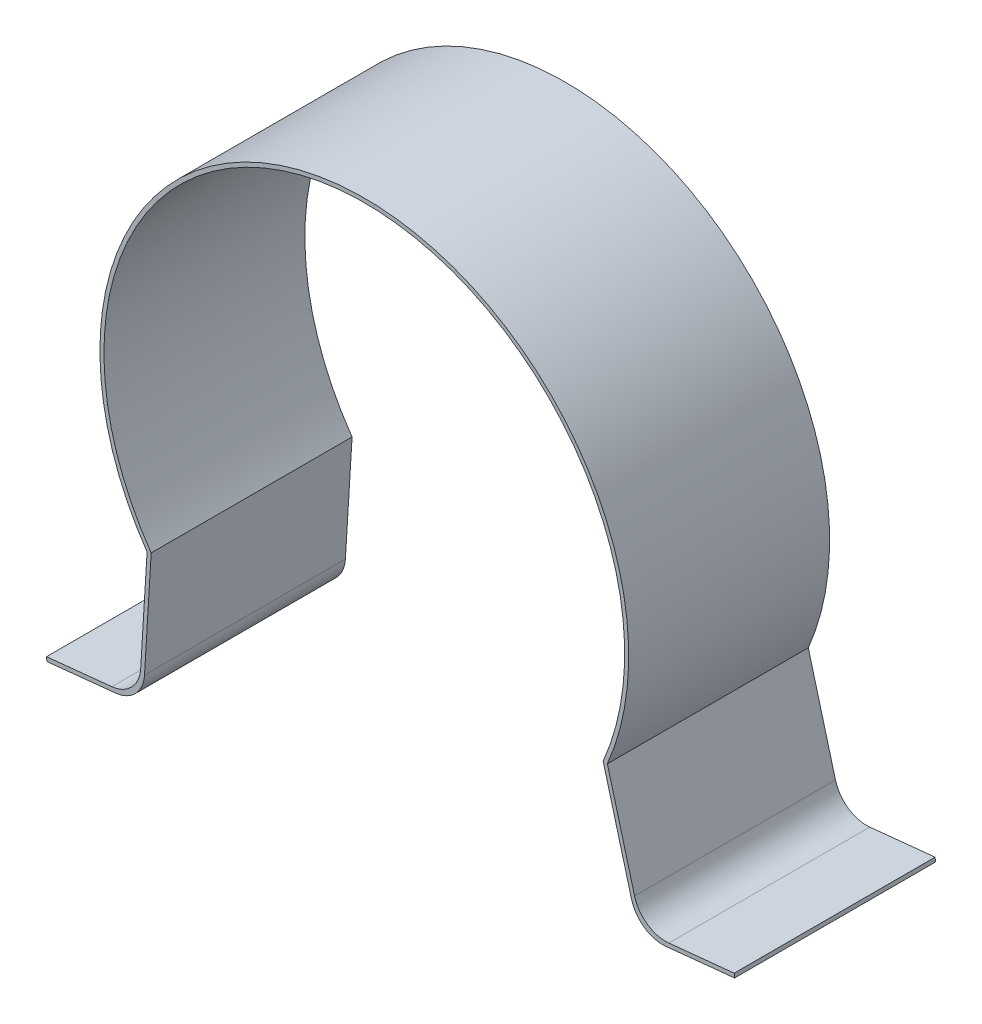
ISO-10303-21;
HEADER;
FILE_DESCRIPTION(('STEP AP214'),'2;1');
FILE_NAME('part.step','',(''),(''),'','','');
FILE_SCHEMA(('AUTOMOTIVE_DESIGN { 1 0 10303 214 1 1 1 1 }'));
ENDSEC;
DATA;
#1=APPLICATION_CONTEXT('core data for automotive mechanical design processes');
#2=APPLICATION_PROTOCOL_DEFINITION('international standard','automotive_design',2000,#1);
#3=PRODUCT_CONTEXT('',#1,'mechanical');
#4=PRODUCT('Part','Part','',(#3));
#5=PRODUCT_RELATED_PRODUCT_CATEGORY('part','',(#4));
#6=PRODUCT_DEFINITION_FORMATION('','',#4);
#7=PRODUCT_DEFINITION_CONTEXT('part definition',#1,'design');
#8=PRODUCT_DEFINITION('design','',#6,#7);
#9=PRODUCT_DEFINITION_SHAPE('','',#8);
#10=(LENGTH_UNIT() NAMED_UNIT(*) SI_UNIT(.MILLI.,.METRE.));
#11=(NAMED_UNIT(*) PLANE_ANGLE_UNIT() SI_UNIT($,.RADIAN.));
#12=(NAMED_UNIT(*) SI_UNIT($,.STERADIAN.) SOLID_ANGLE_UNIT());
#13=UNCERTAINTY_MEASURE_WITH_UNIT(LENGTH_MEASURE(1.E-05),#10,'distance_accuracy_value','');
#14=(GEOMETRIC_REPRESENTATION_CONTEXT(3) GLOBAL_UNCERTAINTY_ASSIGNED_CONTEXT((#13)) GLOBAL_UNIT_ASSIGNED_CONTEXT((#10,
#11,#12)) REPRESENTATION_CONTEXT('',''));
#15=CARTESIAN_POINT('',(0.,0.,0.));
#16=DIRECTION('',(0.,0.,1.));
#17=DIRECTION('',(1.,0.,0.));
#18=AXIS2_PLACEMENT_3D('',#15,#16,#17);
#19=CARTESIAN_POINT('',(34.13885107895,-29.3253596362525,25.));
#20=DIRECTION('',(-0.100816946259273,0.994904992120833,0.));
#21=DIRECTION('',(-0.994904992120833,-0.100816946259273,0.));
#22=AXIS2_PLACEMENT_3D('',#19,#20,#21);
#23=PLANE('',#22);
#24=DIRECTION('',(0.994904992120833,0.100816946259273,0.));
#25=VECTOR('',#24,1.);
#26=CARTESIAN_POINT('',(34.13885107895,-29.3253596362525,25.));
#27=LINE('',#26,#25);
#28=CARTESIAN_POINT('',(37.5202837419189,-28.9827081089592,25.));
#29=VERTEX_POINT('',#28);
#30=CARTESIAN_POINT('',(46.0777109843999,-28.1155562811412,25.));
#31=VERTEX_POINT('',#30);
#32=EDGE_CURVE('E144',#29,#31,#27,.T.);
#33=ORIENTED_EDGE('',*,*,#32,.F.);
#34=DIRECTION('',(0.,0.,-1.));
#35=VECTOR('',#34,1.);
#36=CARTESIAN_POINT('',(37.5202837419189,-28.9827081089592,25.));
#37=LINE('',#36,#35);
#38=CARTESIAN_POINT('',(37.5202837419189,-28.9827081089592,0.));
#39=VERTEX_POINT('',#38);
#40=EDGE_CURVE('E256',#29,#39,#37,.T.);
#41=ORIENTED_EDGE('',*,*,#40,.T.);
#42=DIRECTION('',(0.994904992120833,0.100816946259273,0.));
#43=VECTOR('',#42,1.);
#44=CARTESIAN_POINT('',(34.13885107895,-29.3253596362525,0.));
#45=LINE('',#44,#43);
#46=CARTESIAN_POINT('',(46.0777109843999,-28.1155562811412,0.));
#47=VERTEX_POINT('',#46);
#48=EDGE_CURVE('E159',#39,#47,#45,.T.);
#49=ORIENTED_EDGE('',*,*,#48,.T.);
#50=DIRECTION('',(0.,0.,-1.));
#51=VECTOR('',#50,1.);
#52=CARTESIAN_POINT('',(46.0777109843999,-28.1155562811412,25.));
#53=LINE('',#52,#51);
#54=EDGE_CURVE('E157',#31,#47,#53,.T.);
#55=ORIENTED_EDGE('',*,*,#54,.F.);
#56=EDGE_LOOP('',(#33,#41,#49,#55));
#57=FACE_BOUND('',#56,.T.);
#58=ADVANCED_FACE('F32',(#57),#23,.F.);
#59=CARTESIAN_POINT('',(46.0273025112703,-27.6181037850808,25.));
#60=DIRECTION('',(0.994904992120833,0.100816946259269,0.));
#61=DIRECTION('',(-0.100816946259269,0.994904992120833,0.));
#62=AXIS2_PLACEMENT_3D('',#59,#60,#61);
#63=PLANE('',#62);
#64=DIRECTION('',(0.100816946259269,-0.994904992120833,0.));
#65=VECTOR('',#64,1.);
#66=CARTESIAN_POINT('',(46.0273025112703,-27.6181037850808,0.));
#67=LINE('',#66,#65);
#68=CARTESIAN_POINT('',(46.0273025112703,-27.6181037850808,0.));
#69=VERTEX_POINT('',#68);
#70=EDGE_CURVE('E198',#69,#47,#67,.T.);
#71=ORIENTED_EDGE('',*,*,#70,.F.);
#72=DIRECTION('',(0.,0.,-1.));
#73=VECTOR('',#72,1.);
#74=CARTESIAN_POINT('',(46.0273025112703,-27.6181037850808,25.));
#75=LINE('',#74,#73);
#76=CARTESIAN_POINT('',(46.0273025112703,-27.6181037850808,25.));
#77=VERTEX_POINT('',#76);
#78=EDGE_CURVE('E164',#77,#69,#75,.T.);
#79=ORIENTED_EDGE('',*,*,#78,.F.);
#80=DIRECTION('',(0.100816946259269,-0.994904992120833,0.));
#81=VECTOR('',#80,1.);
#82=CARTESIAN_POINT('',(46.0273025112703,-27.6181037850808,25.));
#83=LINE('',#82,#81);
#84=EDGE_CURVE('E149',#77,#31,#83,.T.);
#85=ORIENTED_EDGE('',*,*,#84,.T.);
#86=ORIENTED_EDGE('',*,*,#54,.T.);
#87=EDGE_LOOP('',(#71,#79,#85,#86));
#88=FACE_BOUND('',#87,.T.);
#89=ADVANCED_FACE('F167',(#88),#63,.T.);
#90=CARTESIAN_POINT('',(34.0884426058203,-28.827907140192,25.));
#91=DIRECTION('',(-0.100816946259273,0.994904992120833,0.));
#92=DIRECTION('',(-0.994904992120833,-0.100816946259273,0.));
#93=AXIS2_PLACEMENT_3D('',#90,#91,#92);
#94=PLANE('',#93);
#95=DIRECTION('',(0.994904992120833,0.100816946259273,0.));
#96=VECTOR('',#95,1.);
#97=CARTESIAN_POINT('',(34.0884426058203,-28.827907140192,0.));
#98=LINE('',#97,#96);
#99=CARTESIAN_POINT('',(37.8925543516604,-28.4424241719871,0.));
#100=VERTEX_POINT('',#99);
#101=EDGE_CURVE('E200',#100,#69,#98,.T.);
#102=ORIENTED_EDGE('',*,*,#101,.F.);
#103=DIRECTION('',(0.,0.,-1.));
#104=VECTOR('',#103,1.);
#105=CARTESIAN_POINT('',(37.8925543516604,-28.4424241719871,25.));
#106=LINE('',#105,#104);
#107=CARTESIAN_POINT('',(37.8925543516604,-28.4424241719871,25.));
#108=VERTEX_POINT('',#107);
#109=EDGE_CURVE('E47',#100,#108,#106,.F.);
#110=ORIENTED_EDGE('',*,*,#109,.T.);
#111=DIRECTION('',(0.994904992120833,0.100816946259273,0.));
#112=VECTOR('',#111,1.);
#113=CARTESIAN_POINT('',(34.0884426058203,-28.827907140192,25.));
#114=LINE('',#113,#112);
#115=EDGE_CURVE('E169',#108,#77,#114,.T.);
#116=ORIENTED_EDGE('',*,*,#115,.T.);
#117=ORIENTED_EDGE('',*,*,#78,.T.);
#118=EDGE_LOOP('',(#102,#110,#116,#117));
#119=FACE_BOUND('',#118,.T.);
#120=ADVANCED_FACE('F291',(#119),#94,.T.);
#121=CARTESIAN_POINT('',(30.1993785986346,-12.7805551171039,25.));
#122=DIRECTION('',(0.965572828298591,0.260132876144979,0.));
#123=DIRECTION('',(-0.260132876144979,0.965572828298591,0.));
#124=AXIS2_PLACEMENT_3D('',#121,#122,#123);
#125=PLANE('',#124);
#126=DIRECTION('',(0.260132876144979,-0.965572828298591,0.));
#127=VECTOR('',#126,1.);
#128=CARTESIAN_POINT('',(30.1993785986346,-12.7805551171039,25.));
#129=LINE('',#128,#127);
#130=CARTESIAN_POINT('',(30.2446820545754,-12.9487145083071,25.));
#131=VERTEX_POINT('',#130);
#132=CARTESIAN_POINT('',(33.6269952534289,-25.5033357080837,25.));
#133=VERTEX_POINT('',#132);
#134=EDGE_CURVE('E171',#131,#133,#129,.T.);
#135=ORIENTED_EDGE('',*,*,#134,.T.);
#136=DIRECTION('',(0.,0.,-1.));
#137=VECTOR('',#136,1.);
#138=CARTESIAN_POINT('',(33.6269952534289,-25.5033357080837,0.));
#139=LINE('',#138,#137);
#140=CARTESIAN_POINT('',(33.6269952534289,-25.5033357080837,0.));
#141=VERTEX_POINT('',#140);
#142=EDGE_CURVE('E260',#133,#141,#139,.T.);
#143=ORIENTED_EDGE('',*,*,#142,.T.);
#144=DIRECTION('',(0.260132876144979,-0.965572828298591,0.));
#145=VECTOR('',#144,1.);
#146=CARTESIAN_POINT('',(30.1993785986346,-12.7805551171039,0.));
#147=LINE('',#146,#145);
#148=CARTESIAN_POINT('',(30.2446820545754,-12.9487145083071,0.));
#149=VERTEX_POINT('',#148);
#150=EDGE_CURVE('E202',#149,#141,#147,.T.);
#151=ORIENTED_EDGE('',*,*,#150,.F.);
#152=DIRECTION('',(0.,0.,-1.));
#153=VECTOR('',#152,1.);
#154=CARTESIAN_POINT('',(30.2446820545754,-12.9487145083071,25.));
#155=LINE('',#154,#153);
#156=EDGE_CURVE('E236',#131,#149,#155,.T.);
#157=ORIENTED_EDGE('',*,*,#156,.F.);
#158=EDGE_LOOP('',(#135,#143,#151,#157));
#159=FACE_BOUND('',#158,.T.);
#160=ADVANCED_FACE('F351',(#159),#125,.T.);
#161=CARTESIAN_POINT('',(0.,0.,25.));
#162=DIRECTION('',(0.,0.,-1.));
#163=DIRECTION('',(-1.,0.,0.));
#164=AXIS2_PLACEMENT_3D('',#161,#162,#163);
#165=CYLINDRICAL_SURFACE('',#164,32.9);
#166=CARTESIAN_POINT('',(0.,0.,0.));
#167=DIRECTION('',(0.,0.,1.));
#168=DIRECTION('',(1.,0.,0.));
#169=AXIS2_PLACEMENT_3D('',#166,#167,#168);
#170=CIRCLE('',#169,32.9);
#171=CARTESIAN_POINT('',(-27.0324178448474,-18.75255677132,0.));
#172=VERTEX_POINT('',#171);
#173=EDGE_CURVE('E204',#172,#149,#170,.F.);
#174=ORIENTED_EDGE('',*,*,#173,.F.);
#175=DIRECTION('',(0.,0.,-1.));
#176=VECTOR('',#175,1.);
#177=CARTESIAN_POINT('',(-27.0324178448474,-18.75255677132,25.));
#178=LINE('',#177,#176);
#179=CARTESIAN_POINT('',(-27.0324178448474,-18.75255677132,25.));
#180=VERTEX_POINT('',#179);
#181=EDGE_CURVE('E233',#180,#172,#178,.T.);
#182=ORIENTED_EDGE('',*,*,#181,.F.);
#183=CARTESIAN_POINT('',(0.,0.,25.));
#184=DIRECTION('',(0.,0.,1.));
#185=DIRECTION('',(1.,0.,0.));
#186=AXIS2_PLACEMENT_3D('',#183,#184,#185);
#187=CIRCLE('',#186,32.9);
#188=EDGE_CURVE('E176',#180,#131,#187,.F.);
#189=ORIENTED_EDGE('',*,*,#188,.T.);
#190=ORIENTED_EDGE('',*,*,#156,.T.);
#191=EDGE_LOOP('',(#174,#182,#189,#190));
#192=FACE_BOUND('',#191,.T.);
#193=ADVANCED_FACE('F347',(#192),#165,.T.);
#194=CARTESIAN_POINT('',(-27.0217867900378,-18.5787545248821,25.));
#195=DIRECTION('',(-0.998134499547706,0.0610534258879136,0.));
#196=DIRECTION('',(-0.0610534258879136,-0.998134499547706,0.));
#197=AXIS2_PLACEMENT_3D('',#194,#195,#196);
#198=PLANE('',#197);
#199=DIRECTION('',(0.0610534258879136,0.998134499547706,0.));
#200=VECTOR('',#199,1.);
#201=CARTESIAN_POINT('',(-27.0217867900378,-18.5787545248821,0.));
#202=LINE('',#201,#200);
#203=CARTESIAN_POINT('',(-27.8264931343679,-31.7345300215016,0.));
#204=VERTEX_POINT('',#203);
#205=EDGE_CURVE('E207',#204,#172,#202,.T.);
#206=ORIENTED_EDGE('',*,*,#205,.F.);
#207=DIRECTION('',(0.,0.,-1.));
#208=VECTOR('',#207,1.);
#209=CARTESIAN_POINT('',(-27.8264931343679,-31.7345300215016,25.));
#210=LINE('',#209,#208);
#211=CARTESIAN_POINT('',(-27.8264931343679,-31.7345300215016,25.));
#212=VERTEX_POINT('',#211);
#213=EDGE_CURVE('E241',#204,#212,#210,.F.);
#214=ORIENTED_EDGE('',*,*,#213,.T.);
#215=DIRECTION('',(0.0610534258879136,0.998134499547706,0.));
#216=VECTOR('',#215,1.);
#217=CARTESIAN_POINT('',(-27.0217867900378,-18.5787545248821,25.));
#218=LINE('',#217,#216);
#219=EDGE_CURVE('E179',#212,#180,#218,.T.);
#220=ORIENTED_EDGE('',*,*,#219,.T.);
#221=ORIENTED_EDGE('',*,*,#181,.T.);
#222=EDGE_LOOP('',(#206,#214,#220,#221));
#223=FACE_BOUND('',#222,.T.);
#224=ADVANCED_FACE('F344',(#223),#198,.T.);
#225=CARTESIAN_POINT('',(-27.6115898740664,-35.0801716455074,25.));
#226=DIRECTION('',(-0.101924187415924,0.99479216925929,0.));
#227=DIRECTION('',(-0.99479216925929,-0.101924187415924,0.));
#228=AXIS2_PLACEMENT_3D('',#225,#226,#227);
#229=PLANE('',#228);
#230=DIRECTION('',(0.99479216925929,0.101924187415924,0.));
#231=VECTOR('',#230,1.);
#232=CARTESIAN_POINT('',(-27.6115898740664,-35.0801716455074,25.));
#233=LINE('',#232,#231);
#234=CARTESIAN_POINT('',(-39.5490959051865,-36.3032618944994,25.));
#235=VERTEX_POINT('',#234);
#236=CARTESIAN_POINT('',(-31.4113343828951,-35.4694849949871,25.));
#237=VERTEX_POINT('',#236);
#238=EDGE_CURVE('E181',#235,#237,#233,.T.);
#239=ORIENTED_EDGE('',*,*,#238,.T.);
#240=DIRECTION('',(0.,0.,-1.));
#241=VECTOR('',#240,1.);
#242=CARTESIAN_POINT('',(-31.4113343828951,-35.4694849949871,0.));
#243=LINE('',#242,#241);
#244=CARTESIAN_POINT('',(-31.4113343828951,-35.4694849949871,0.));
#245=VERTEX_POINT('',#244);
#246=EDGE_CURVE('E163',#237,#245,#243,.T.);
#247=ORIENTED_EDGE('',*,*,#246,.T.);
#248=DIRECTION('',(0.99479216925929,0.101924187415924,0.));
#249=VECTOR('',#248,1.);
#250=CARTESIAN_POINT('',(-27.6115898740664,-35.0801716455074,0.));
#251=LINE('',#250,#249);
#252=CARTESIAN_POINT('',(-39.5490959051865,-36.3032618944994,0.));
#253=VERTEX_POINT('',#252);
#254=EDGE_CURVE('E209',#253,#245,#251,.T.);
#255=ORIENTED_EDGE('',*,*,#254,.F.);
#256=DIRECTION('',(0.,0.,-1.));
#257=VECTOR('',#256,1.);
#258=CARTESIAN_POINT('',(-39.5490959051865,-36.3032618944994,25.));
#259=LINE('',#258,#257);
#260=EDGE_CURVE('E231',#235,#253,#259,.T.);
#261=ORIENTED_EDGE('',*,*,#260,.F.);
#262=EDGE_LOOP('',(#239,#247,#255,#261));
#263=FACE_BOUND('',#262,.T.);
#264=ADVANCED_FACE('F309',(#263),#229,.T.);
#265=CARTESIAN_POINT('',(-39.4981338114785,-36.800657979129,25.));
#266=DIRECTION('',(-0.994792169259289,-0.101924187415933,0.));
#267=DIRECTION('',(0.101924187415933,-0.994792169259289,0.));
#268=AXIS2_PLACEMENT_3D('',#265,#266,#267);
#269=PLANE('',#268);
#270=DIRECTION('',(-0.101924187415933,0.994792169259289,0.));
#271=VECTOR('',#270,1.);
#272=CARTESIAN_POINT('',(-39.4981338114785,-36.800657979129,0.));
#273=LINE('',#272,#271);
#274=CARTESIAN_POINT('',(-39.4981338114785,-36.800657979129,0.));
#275=VERTEX_POINT('',#274);
#276=EDGE_CURVE('E212',#275,#253,#273,.T.);
#277=ORIENTED_EDGE('',*,*,#276,.F.);
#278=DIRECTION('',(0.,0.,-1.));
#279=VECTOR('',#278,1.);
#280=CARTESIAN_POINT('',(-39.4981338114785,-36.800657979129,25.));
#281=LINE('',#280,#279);
#282=CARTESIAN_POINT('',(-39.4981338114785,-36.800657979129,25.));
#283=VERTEX_POINT('',#282);
#284=EDGE_CURVE('E229',#283,#275,#281,.T.);
#285=ORIENTED_EDGE('',*,*,#284,.F.);
#286=DIRECTION('',(-0.101924187415933,0.994792169259289,0.));
#287=VECTOR('',#286,1.);
#288=CARTESIAN_POINT('',(-39.4981338114785,-36.800657979129,25.));
#289=LINE('',#288,#287);
#290=EDGE_CURVE('E184',#283,#235,#289,.T.);
#291=ORIENTED_EDGE('',*,*,#290,.T.);
#292=ORIENTED_EDGE('',*,*,#260,.T.);
#293=EDGE_LOOP('',(#277,#285,#291,#292));
#294=FACE_BOUND('',#293,.T.);
#295=ADVANCED_FACE('F313',(#294),#269,.T.);
#296=CARTESIAN_POINT('',(-27.5606277803584,-35.577567730137,25.));
#297=DIRECTION('',(-0.101924187415924,0.99479216925929,0.));
#298=DIRECTION('',(-0.99479216925929,-0.101924187415924,0.));
#299=AXIS2_PLACEMENT_3D('',#296,#297,#298);
#300=PLANE('',#299);
#301=DIRECTION('',(0.99479216925929,0.101924187415924,0.));
#302=VECTOR('',#301,1.);
#303=CARTESIAN_POINT('',(-27.5606277803584,-35.577567730137,0.));
#304=LINE('',#303,#302);
#305=CARTESIAN_POINT('',(-30.9381784548728,-35.9236240407856,0.));
#306=VERTEX_POINT('',#305);
#307=EDGE_CURVE('E215',#275,#306,#304,.T.);
#308=ORIENTED_EDGE('',*,*,#307,.T.);
#309=DIRECTION('',(0.,0.,-1.));
#310=VECTOR('',#309,1.);
#311=CARTESIAN_POINT('',(-30.9381784548728,-35.9236240407856,25.));
#312=LINE('',#311,#310);
#313=CARTESIAN_POINT('',(-30.9381784548728,-35.9236240407856,25.));
#314=VERTEX_POINT('',#313);
#315=EDGE_CURVE('E252',#306,#314,#312,.F.);
#316=ORIENTED_EDGE('',*,*,#315,.T.);
#317=DIRECTION('',(0.99479216925929,0.101924187415924,0.));
#318=VECTOR('',#317,1.);
#319=CARTESIAN_POINT('',(-27.5606277803584,-35.577567730137,25.));
#320=LINE('',#319,#318);
#321=EDGE_CURVE('E187',#283,#314,#320,.T.);
#322=ORIENTED_EDGE('',*,*,#321,.F.);
#323=ORIENTED_EDGE('',*,*,#284,.T.);
#324=EDGE_LOOP('',(#308,#316,#322,#323));
#325=FACE_BOUND('',#324,.T.);
#326=ADVANCED_FACE('F335',(#325),#300,.F.);
#327=CARTESIAN_POINT('',(-26.5227195402639,-18.609281237826,25.));
#328=DIRECTION('',(-0.998134499547706,0.0610534258879136,0.));
#329=DIRECTION('',(-0.0610534258879136,-0.998134499547706,0.));
#330=AXIS2_PLACEMENT_3D('',#327,#328,#329);
#331=PLANE('',#330);
#332=DIRECTION('',(0.0610534258879136,0.998134499547706,0.));
#333=VECTOR('',#332,1.);
#334=CARTESIAN_POINT('',(-26.5227195402639,-18.609281237826,25.));
#335=LINE('',#334,#333);
#336=CARTESIAN_POINT('',(-27.3533372063457,-32.1886690673001,25.));
#337=VERTEX_POINT('',#336);
#338=CARTESIAN_POINT('',(-26.5227195402639,-18.609281237826,25.));
#339=VERTEX_POINT('',#338);
#340=EDGE_CURVE('E190',#337,#339,#335,.T.);
#341=ORIENTED_EDGE('',*,*,#340,.F.);
#342=DIRECTION('',(0.,0.,-1.));
#343=VECTOR('',#342,1.);
#344=CARTESIAN_POINT('',(-27.3533372063457,-32.1886690673001,25.));
#345=LINE('',#344,#343);
#346=CARTESIAN_POINT('',(-27.3533372063457,-32.1886690673001,0.));
#347=VERTEX_POINT('',#346);
#348=EDGE_CURVE('E247',#337,#347,#345,.T.);
#349=ORIENTED_EDGE('',*,*,#348,.T.);
#350=DIRECTION('',(0.0610534258879136,0.998134499547706,0.));
#351=VECTOR('',#350,1.);
#352=CARTESIAN_POINT('',(-26.5227195402639,-18.609281237826,0.));
#353=LINE('',#352,#351);
#354=CARTESIAN_POINT('',(-26.5227195402639,-18.609281237826,0.));
#355=VERTEX_POINT('',#354);
#356=EDGE_CURVE('E218',#347,#355,#353,.T.);
#357=ORIENTED_EDGE('',*,*,#356,.T.);
#358=DIRECTION('',(0.,0.,-1.));
#359=VECTOR('',#358,1.);
#360=CARTESIAN_POINT('',(-26.5227195402639,-18.609281237826,25.));
#361=LINE('',#360,#359);
#362=EDGE_CURVE('E226',#339,#355,#361,.T.);
#363=ORIENTED_EDGE('',*,*,#362,.F.);
#364=EDGE_LOOP('',(#341,#349,#357,#363));
#365=FACE_BOUND('',#364,.T.);
#366=ADVANCED_FACE('F322',(#365),#331,.F.);
#367=CARTESIAN_POINT('',(0.,0.,25.));
#368=DIRECTION('',(0.,0.,-1.));
#369=DIRECTION('',(-1.,0.,0.));
#370=AXIS2_PLACEMENT_3D('',#367,#368,#369);
#371=CYLINDRICAL_SURFACE('',#370,32.4);
#372=CARTESIAN_POINT('',(0.,0.,0.));
#373=DIRECTION('',(0.,0.,-1.));
#374=DIRECTION('',(1.,0.,0.));
#375=AXIS2_PLACEMENT_3D('',#372,#373,#374);
#376=CIRCLE('',#375,32.4);
#377=CARTESIAN_POINT('',(29.7165921844853,-12.9106215551764,0.));
#378=VERTEX_POINT('',#377);
#379=EDGE_CURVE('E220',#355,#378,#376,.T.);
#380=ORIENTED_EDGE('',*,*,#379,.T.);
#381=DIRECTION('',(0.,0.,-1.));
#382=VECTOR('',#381,1.);
#383=CARTESIAN_POINT('',(29.7165921844853,-12.9106215551764,25.));
#384=LINE('',#383,#382);
#385=CARTESIAN_POINT('',(29.7165921844853,-12.9106215551764,25.));
#386=VERTEX_POINT('',#385);
#387=EDGE_CURVE('E196',#386,#378,#384,.T.);
#388=ORIENTED_EDGE('',*,*,#387,.F.);
#389=CARTESIAN_POINT('',(0.,0.,25.));
#390=DIRECTION('',(0.,0.,-1.));
#391=DIRECTION('',(1.,0.,0.));
#392=AXIS2_PLACEMENT_3D('',#389,#390,#391);
#393=CIRCLE('',#392,32.4);
#394=EDGE_CURVE('E192',#339,#386,#393,.T.);
#395=ORIENTED_EDGE('',*,*,#394,.F.);
#396=ORIENTED_EDGE('',*,*,#362,.T.);
#397=EDGE_LOOP('',(#380,#388,#395,#396));
#398=FACE_BOUND('',#397,.T.);
#399=ADVANCED_FACE('F326',(#398),#371,.F.);
#400=CARTESIAN_POINT('',(29.7165921844853,-12.9106215551764,25.));
#401=DIRECTION('',(0.965572828298591,0.260132876144979,0.));
#402=DIRECTION('',(-0.260132876144979,0.965572828298591,0.));
#403=AXIS2_PLACEMENT_3D('',#400,#401,#402);
#404=PLANE('',#403);
#405=DIRECTION('',(0.260132876144979,-0.965572828298591,0.));
#406=VECTOR('',#405,1.);
#407=CARTESIAN_POINT('',(29.7165921844853,-12.9106215551764,0.));
#408=LINE('',#407,#406);
#409=CARTESIAN_POINT('',(33.2547246436874,-26.0436196450558,0.));
#410=VERTEX_POINT('',#409);
#411=EDGE_CURVE('E154',#378,#410,#408,.T.);
#412=ORIENTED_EDGE('',*,*,#411,.T.);
#413=DIRECTION('',(0.,0.,-1.));
#414=VECTOR('',#413,1.);
#415=CARTESIAN_POINT('',(33.2547246436874,-26.0436196450558,25.));
#416=LINE('',#415,#414);
#417=CARTESIAN_POINT('',(33.2547246436874,-26.0436196450558,25.));
#418=VERTEX_POINT('',#417);
#419=EDGE_CURVE('E258',#410,#418,#416,.F.);
#420=ORIENTED_EDGE('',*,*,#419,.T.);
#421=DIRECTION('',(0.260132876144979,-0.965572828298591,0.));
#422=VECTOR('',#421,1.);
#423=CARTESIAN_POINT('',(29.7165921844853,-12.9106215551764,25.));
#424=LINE('',#423,#422);
#425=EDGE_CURVE('E194',#386,#418,#424,.T.);
#426=ORIENTED_EDGE('',*,*,#425,.F.);
#427=ORIENTED_EDGE('',*,*,#387,.T.);
#428=EDGE_LOOP('',(#412,#420,#426,#427));
#429=FACE_BOUND('',#428,.T.);
#430=ADVANCED_FACE('F272',(#429),#404,.F.);
#431=CARTESIAN_POINT('',(0.,0.,25.));
#432=DIRECTION('',(0.,0.,1.));
#433=DIRECTION('',(1.,0.,0.));
#434=AXIS2_PLACEMENT_3D('',#431,#432,#433);
#435=PLANE('',#434);
#436=ORIENTED_EDGE('',*,*,#425,.T.);
#437=CARTESIAN_POINT('',(37.1170159568818,-25.0030881404759,25.));
#438=DIRECTION('',(0.,0.,1.));
#439=DIRECTION('',(1.,0.,0.));
#440=AXIS2_PLACEMENT_3D('',#437,#438,#439);
#441=CIRCLE('',#440,4.);
#442=EDGE_CURVE('E11',#418,#29,#441,.T.);
#443=ORIENTED_EDGE('',*,*,#442,.T.);
#444=ORIENTED_EDGE('',*,*,#32,.T.);
#445=ORIENTED_EDGE('',*,*,#84,.F.);
#446=ORIENTED_EDGE('',*,*,#115,.F.);
#447=CARTESIAN_POINT('',(37.4892865666233,-24.4628042035038,25.));
#448=DIRECTION('',(0.,0.,1.));
#449=DIRECTION('',(1.,0.,0.));
#450=AXIS2_PLACEMENT_3D('',#447,#448,#449);
#451=CIRCLE('',#450,4.);
#452=EDGE_CURVE('E265',#108,#133,#451,.F.);
#453=ORIENTED_EDGE('',*,*,#452,.T.);
#454=ORIENTED_EDGE('',*,*,#134,.F.);
#455=ORIENTED_EDGE('',*,*,#188,.F.);
#456=ORIENTED_EDGE('',*,*,#219,.F.);
#457=CARTESIAN_POINT('',(-31.8190311325588,-31.4903163179499,25.));
#458=DIRECTION('',(0.,0.,1.));
#459=DIRECTION('',(1.,0.,0.));
#460=AXIS2_PLACEMENT_3D('',#457,#458,#459);
#461=CIRCLE('',#460,4.);
#462=EDGE_CURVE('E245',#212,#237,#461,.F.);
#463=ORIENTED_EDGE('',*,*,#462,.T.);
#464=ORIENTED_EDGE('',*,*,#238,.F.);
#465=ORIENTED_EDGE('',*,*,#290,.F.);
#466=ORIENTED_EDGE('',*,*,#321,.T.);
#467=CARTESIAN_POINT('',(-31.3458752045365,-31.9444553637485,25.));
#468=DIRECTION('',(0.,0.,1.));
#469=DIRECTION('',(1.,0.,0.));
#470=AXIS2_PLACEMENT_3D('',#467,#468,#469);
#471=CIRCLE('',#470,4.);
#472=EDGE_CURVE('E254',#314,#337,#471,.T.);
#473=ORIENTED_EDGE('',*,*,#472,.T.);
#474=ORIENTED_EDGE('',*,*,#340,.T.);
#475=ORIENTED_EDGE('',*,*,#394,.T.);
#476=EDGE_LOOP('',(#436,#443,#444,#445,#446,#453,#454,#455,#456,#463,#464,#465,#466,#473,#474,#475));
#477=FACE_BOUND('',#476,.T.);
#478=ADVANCED_FACE('F147',(#477),#435,.T.);
#479=CARTESIAN_POINT('',(0.,0.,0.));
#480=DIRECTION('',(0.,0.,1.));
#481=DIRECTION('',(1.,0.,0.));
#482=AXIS2_PLACEMENT_3D('',#479,#480,#481);
#483=PLANE('',#482);
#484=ORIENTED_EDGE('',*,*,#48,.F.);
#485=CARTESIAN_POINT('',(37.1170159568818,-25.0030881404759,0.));
#486=DIRECTION('',(0.,0.,1.));
#487=DIRECTION('',(1.,0.,0.));
#488=AXIS2_PLACEMENT_3D('',#485,#486,#487);
#489=CIRCLE('',#488,4.);
#490=EDGE_CURVE('E40',#39,#410,#489,.F.);
#491=ORIENTED_EDGE('',*,*,#490,.T.);
#492=ORIENTED_EDGE('',*,*,#411,.F.);
#493=ORIENTED_EDGE('',*,*,#379,.F.);
#494=ORIENTED_EDGE('',*,*,#356,.F.);
#495=CARTESIAN_POINT('',(-31.3458752045365,-31.9444553637485,0.));
#496=DIRECTION('',(0.,0.,1.));
#497=DIRECTION('',(1.,0.,0.));
#498=AXIS2_PLACEMENT_3D('',#495,#496,#497);
#499=CIRCLE('',#498,4.);
#500=EDGE_CURVE('E250',#347,#306,#499,.F.);
#501=ORIENTED_EDGE('',*,*,#500,.T.);
#502=ORIENTED_EDGE('',*,*,#307,.F.);
#503=ORIENTED_EDGE('',*,*,#276,.T.);
#504=ORIENTED_EDGE('',*,*,#254,.T.);
#505=CARTESIAN_POINT('',(-31.8190311325588,-31.4903163179499,0.));
#506=DIRECTION('',(0.,0.,1.));
#507=DIRECTION('',(1.,0.,0.));
#508=AXIS2_PLACEMENT_3D('',#505,#506,#507);
#509=CIRCLE('',#508,4.);
#510=EDGE_CURVE('E243',#245,#204,#509,.T.);
#511=ORIENTED_EDGE('',*,*,#510,.T.);
#512=ORIENTED_EDGE('',*,*,#205,.T.);
#513=ORIENTED_EDGE('',*,*,#173,.T.);
#514=ORIENTED_EDGE('',*,*,#150,.T.);
#515=CARTESIAN_POINT('',(37.4892865666233,-24.4628042035038,0.));
#516=DIRECTION('',(0.,0.,1.));
#517=DIRECTION('',(1.,0.,0.));
#518=AXIS2_PLACEMENT_3D('',#515,#516,#517);
#519=CIRCLE('',#518,4.);
#520=EDGE_CURVE('E55',#141,#100,#519,.T.);
#521=ORIENTED_EDGE('',*,*,#520,.T.);
#522=ORIENTED_EDGE('',*,*,#101,.T.);
#523=ORIENTED_EDGE('',*,*,#70,.T.);
#524=EDGE_LOOP('',(#484,#491,#492,#493,#494,#501,#502,#503,#504,#511,#512,#513,#514,#521,#522,#523));
#525=FACE_BOUND('',#524,.T.);
#526=ADVANCED_FACE('F267',(#525),#483,.F.);
#527=CARTESIAN_POINT('',(-31.8190311325588,-31.4903163179499,25.));
#528=DIRECTION('',(0.,0.,1.));
#529=DIRECTION('',(1.,0.,0.));
#530=AXIS2_PLACEMENT_3D('',#527,#528,#529);
#531=CYLINDRICAL_SURFACE('',#530,4.);
#532=ORIENTED_EDGE('',*,*,#462,.F.);
#533=ORIENTED_EDGE('',*,*,#213,.F.);
#534=ORIENTED_EDGE('',*,*,#510,.F.);
#535=ORIENTED_EDGE('',*,*,#246,.F.);
#536=EDGE_LOOP('',(#532,#533,#534,#535));
#537=FACE_BOUND('',#536,.T.);
#538=ADVANCED_FACE('F283',(#537),#531,.F.);
#539=CARTESIAN_POINT('',(-31.3458752045365,-31.9444553637485,25.));
#540=DIRECTION('',(0.,0.,-1.));
#541=DIRECTION('',(-1.,0.,0.));
#542=AXIS2_PLACEMENT_3D('',#539,#540,#541);
#543=CYLINDRICAL_SURFACE('',#542,4.);
#544=ORIENTED_EDGE('',*,*,#472,.F.);
#545=ORIENTED_EDGE('',*,*,#315,.F.);
#546=ORIENTED_EDGE('',*,*,#500,.F.);
#547=ORIENTED_EDGE('',*,*,#348,.F.);
#548=EDGE_LOOP('',(#544,#545,#546,#547));
#549=FACE_BOUND('',#548,.T.);
#550=ADVANCED_FACE('F277',(#549),#543,.T.);
#551=CARTESIAN_POINT('',(37.1170159568818,-25.0030881404759,25.));
#552=DIRECTION('',(0.,0.,-1.));
#553=DIRECTION('',(-1.,0.,0.));
#554=AXIS2_PLACEMENT_3D('',#551,#552,#553);
#555=CYLINDRICAL_SURFACE('',#554,4.);
#556=ORIENTED_EDGE('',*,*,#442,.F.);
#557=ORIENTED_EDGE('',*,*,#419,.F.);
#558=ORIENTED_EDGE('',*,*,#490,.F.);
#559=ORIENTED_EDGE('',*,*,#40,.F.);
#560=EDGE_LOOP('',(#556,#557,#558,#559));
#561=FACE_BOUND('',#560,.T.);
#562=ADVANCED_FACE('F275',(#561),#555,.T.);
#563=CARTESIAN_POINT('',(37.4892865666233,-24.4628042035038,25.));
#564=DIRECTION('',(0.,0.,1.));
#565=DIRECTION('',(1.,0.,0.));
#566=AXIS2_PLACEMENT_3D('',#563,#564,#565);
#567=CYLINDRICAL_SURFACE('',#566,4.);
#568=ORIENTED_EDGE('',*,*,#452,.F.);
#569=ORIENTED_EDGE('',*,*,#109,.F.);
#570=ORIENTED_EDGE('',*,*,#520,.F.);
#571=ORIENTED_EDGE('',*,*,#142,.F.);
#572=EDGE_LOOP('',(#568,#569,#570,#571));
#573=FACE_BOUND('',#572,.T.);
#574=ADVANCED_FACE('F34',(#573),#567,.F.);
#575=CLOSED_SHELL('',(#58,#89,#120,#160,#193,#224,#264,#295,#326,#366,#399,#430,#478,#526,#538,
#550,#562,#574));
#576=MANIFOLD_SOLID_BREP('B2',#575);
#577=ADVANCED_BREP_SHAPE_REPRESENTATION('',(#18,#576),#14);
#578=SHAPE_DEFINITION_REPRESENTATION(#9,#577);
ENDSEC;
END-ISO-10303-21;
